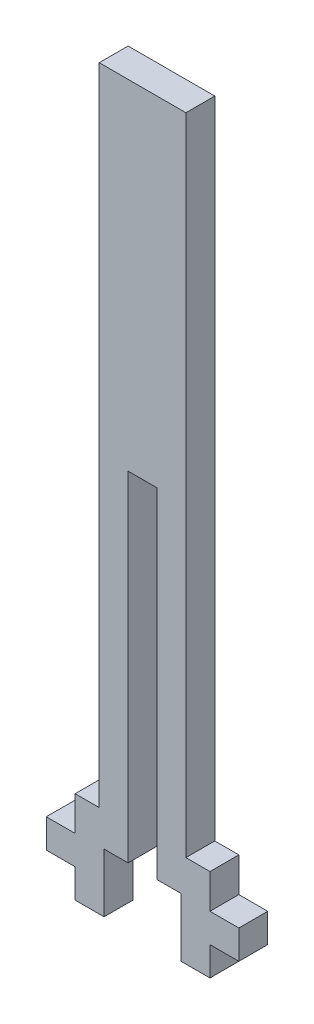
ISO-10303-21;
HEADER;
FILE_DESCRIPTION(('STEP AP214'),'2;1');
FILE_NAME('part.step','',(''),(''),'','','');
FILE_SCHEMA(('AUTOMOTIVE_DESIGN { 1 0 10303 214 1 1 1 1 }'));
ENDSEC;
DATA;
#1=APPLICATION_CONTEXT('core data for automotive mechanical design processes');
#2=APPLICATION_PROTOCOL_DEFINITION('international standard','automotive_design',2000,#1);
#3=PRODUCT_CONTEXT('',#1,'mechanical');
#4=PRODUCT('Part','Part','',(#3));
#5=PRODUCT_RELATED_PRODUCT_CATEGORY('part','',(#4));
#6=PRODUCT_DEFINITION_FORMATION('','',#4);
#7=PRODUCT_DEFINITION_CONTEXT('part definition',#1,'design');
#8=PRODUCT_DEFINITION('design','',#6,#7);
#9=PRODUCT_DEFINITION_SHAPE('','',#8);
#10=(LENGTH_UNIT() NAMED_UNIT(*) SI_UNIT(.MILLI.,.METRE.));
#11=(NAMED_UNIT(*) PLANE_ANGLE_UNIT() SI_UNIT($,.RADIAN.));
#12=(NAMED_UNIT(*) SI_UNIT($,.STERADIAN.) SOLID_ANGLE_UNIT());
#13=UNCERTAINTY_MEASURE_WITH_UNIT(LENGTH_MEASURE(1.E-05),#10,'distance_accuracy_value','');
#14=(GEOMETRIC_REPRESENTATION_CONTEXT(3) GLOBAL_UNCERTAINTY_ASSIGNED_CONTEXT((#13)) GLOBAL_UNIT_ASSIGNED_CONTEXT((#10,
#11,#12)) REPRESENTATION_CONTEXT('',''));
#15=CARTESIAN_POINT('',(0.,0.,0.));
#16=DIRECTION('',(0.,0.,1.));
#17=DIRECTION('',(1.,0.,0.));
#18=AXIS2_PLACEMENT_3D('',#15,#16,#17);
#19=CARTESIAN_POINT('',(7.,0.,3.));
#20=DIRECTION('',(-1.,0.,0.));
#21=DIRECTION('',(0.,0.,1.));
#22=AXIS2_PLACEMENT_3D('',#19,#20,#21);
#23=PLANE('',#22);
#24=DIRECTION('',(0.,0.,1.));
#25=VECTOR('',#24,1.);
#26=CARTESIAN_POINT('',(7.,-32.281500037,0.));
#27=LINE('',#26,#25);
#28=CARTESIAN_POINT('',(7.,-32.281500037,0.));
#29=VERTEX_POINT('',#28);
#30=CARTESIAN_POINT('',(7.,-32.281500037,3.));
#31=VERTEX_POINT('',#30);
#32=EDGE_CURVE('E211',#29,#31,#27,.T.);
#33=ORIENTED_EDGE('',*,*,#32,.F.);
#34=DIRECTION('',(0.,1.,0.));
#35=VECTOR('',#34,1.);
#36=CARTESIAN_POINT('',(7.,0.,0.));
#37=LINE('',#36,#35);
#38=CARTESIAN_POINT('',(7.,-28.706499941,0.));
#39=VERTEX_POINT('',#38);
#40=EDGE_CURVE('E306',#29,#39,#37,.T.);
#41=ORIENTED_EDGE('',*,*,#40,.T.);
#42=DIRECTION('',(0.,0.,-1.));
#43=VECTOR('',#42,1.);
#44=CARTESIAN_POINT('',(7.,-28.706499941,3.));
#45=LINE('',#44,#43);
#46=CARTESIAN_POINT('',(7.,-28.706499941,3.));
#47=VERTEX_POINT('',#46);
#48=EDGE_CURVE('E235',#47,#39,#45,.T.);
#49=ORIENTED_EDGE('',*,*,#48,.F.);
#50=DIRECTION('',(0.,1.,0.));
#51=VECTOR('',#50,1.);
#52=CARTESIAN_POINT('',(7.,0.,3.));
#53=LINE('',#52,#51);
#54=EDGE_CURVE('E227',#31,#47,#53,.T.);
#55=ORIENTED_EDGE('',*,*,#54,.F.);
#56=EDGE_LOOP('',(#33,#41,#49,#55));
#57=FACE_BOUND('',#56,.T.);
#58=ADVANCED_FACE('F50',(#57),#23,.F.);
#59=CARTESIAN_POINT('',(-7.,0.,3.));
#60=DIRECTION('',(1.,0.,0.));
#61=DIRECTION('',(0.,0.,-1.));
#62=AXIS2_PLACEMENT_3D('',#59,#60,#61);
#63=PLANE('',#62);
#64=DIRECTION('',(0.,0.,1.));
#65=VECTOR('',#64,1.);
#66=CARTESIAN_POINT('',(-7.,-35.281500037,0.));
#67=LINE('',#66,#65);
#68=CARTESIAN_POINT('',(-7.,-35.281500037,0.));
#69=VERTEX_POINT('',#68);
#70=CARTESIAN_POINT('',(-7.,-35.281500037,3.));
#71=VERTEX_POINT('',#70);
#72=EDGE_CURVE('E420',#69,#71,#67,.T.);
#73=ORIENTED_EDGE('',*,*,#72,.F.);
#74=DIRECTION('',(0.,-1.,0.));
#75=VECTOR('',#74,1.);
#76=CARTESIAN_POINT('',(-7.,0.,0.));
#77=LINE('',#76,#75);
#78=CARTESIAN_POINT('',(-7.,-38.281500037,0.));
#79=VERTEX_POINT('',#78);
#80=EDGE_CURVE('E283',#69,#79,#77,.T.);
#81=ORIENTED_EDGE('',*,*,#80,.T.);
#82=DIRECTION('',(0.,0.,-1.));
#83=VECTOR('',#82,1.);
#84=CARTESIAN_POINT('',(-7.,-38.281500037,3.));
#85=LINE('',#84,#83);
#86=CARTESIAN_POINT('',(-7.,-38.281500037,3.));
#87=VERTEX_POINT('',#86);
#88=EDGE_CURVE('E346',#87,#79,#85,.T.);
#89=ORIENTED_EDGE('',*,*,#88,.F.);
#90=DIRECTION('',(0.,-1.,0.));
#91=VECTOR('',#90,1.);
#92=CARTESIAN_POINT('',(-7.,0.,3.));
#93=LINE('',#92,#91);
#94=EDGE_CURVE('E877',#71,#87,#93,.T.);
#95=ORIENTED_EDGE('',*,*,#94,.F.);
#96=EDGE_LOOP('',(#73,#81,#89,#95));
#97=FACE_BOUND('',#96,.T.);
#98=ADVANCED_FACE('F544',(#97),#63,.F.);
#99=CARTESIAN_POINT('',(0.,-32.181500037,3.));
#100=DIRECTION('',(0.,1.,0.));
#101=DIRECTION('',(0.,0.,1.));
#102=AXIS2_PLACEMENT_3D('',#99,#100,#101);
#103=PLANE('',#102);
#104=DIRECTION('',(1.,0.,0.));
#105=VECTOR('',#104,1.);
#106=CARTESIAN_POINT('',(0.,-32.181500037,3.));
#107=LINE('',#106,#105);
#108=CARTESIAN_POINT('',(1.5,-32.181500037,3.));
#109=VERTEX_POINT('',#108);
#110=CARTESIAN_POINT('',(4.,-32.181500037,3.));
#111=VERTEX_POINT('',#110);
#112=EDGE_CURVE('E500',#109,#111,#107,.T.);
#113=ORIENTED_EDGE('',*,*,#112,.F.);
#114=DIRECTION('',(0.,0.,-1.));
#115=VECTOR('',#114,1.);
#116=CARTESIAN_POINT('',(1.5,-32.181500037,38.3589959537475));
#117=LINE('',#116,#115);
#118=CARTESIAN_POINT('',(1.5,-32.181500037,0.));
#119=VERTEX_POINT('',#118);
#120=EDGE_CURVE('E396',#109,#119,#117,.T.);
#121=ORIENTED_EDGE('',*,*,#120,.T.);
#122=DIRECTION('',(1.,0.,0.));
#123=VECTOR('',#122,1.);
#124=CARTESIAN_POINT('',(0.,-32.181500037,0.));
#125=LINE('',#124,#123);
#126=CARTESIAN_POINT('',(4.,-32.181500037,0.));
#127=VERTEX_POINT('',#126);
#128=EDGE_CURVE('E294',#119,#127,#125,.T.);
#129=ORIENTED_EDGE('',*,*,#128,.T.);
#130=DIRECTION('',(0.,0.,-1.));
#131=VECTOR('',#130,1.);
#132=CARTESIAN_POINT('',(4.,-32.181500037,3.));
#133=LINE('',#132,#131);
#134=EDGE_CURVE('E334',#111,#127,#133,.T.);
#135=ORIENTED_EDGE('',*,*,#134,.F.);
#136=EDGE_LOOP('',(#113,#121,#129,#135));
#137=FACE_BOUND('',#136,.T.);
#138=ADVANCED_FACE('F521',(#137),#103,.F.);
#139=CARTESIAN_POINT('',(0.,38.281500037,3.));
#140=DIRECTION('',(0.,1.,0.));
#141=DIRECTION('',(0.,0.,1.));
#142=AXIS2_PLACEMENT_3D('',#139,#140,#141);
#143=PLANE('',#142);
#144=DIRECTION('',(1.,0.,0.));
#145=VECTOR('',#144,1.);
#146=CARTESIAN_POINT('',(0.,38.281500037,0.));
#147=LINE('',#146,#145);
#148=CARTESIAN_POINT('',(-4.5,38.281500037,0.));
#149=VERTEX_POINT('',#148);
#150=CARTESIAN_POINT('',(4.5,38.281500037,0.));
#151=VERTEX_POINT('',#150);
#152=EDGE_CURVE('E271',#149,#151,#147,.T.);
#153=ORIENTED_EDGE('',*,*,#152,.F.);
#154=DIRECTION('',(0.,0.,-1.));
#155=VECTOR('',#154,1.);
#156=CARTESIAN_POINT('',(-4.5,38.281500037,3.));
#157=LINE('',#156,#155);
#158=CARTESIAN_POINT('',(-4.5,38.281500037,3.));
#159=VERTEX_POINT('',#158);
#160=EDGE_CURVE('E12',#159,#149,#157,.T.);
#161=ORIENTED_EDGE('',*,*,#160,.F.);
#162=DIRECTION('',(1.,0.,0.));
#163=VECTOR('',#162,1.);
#164=CARTESIAN_POINT('',(0.,38.281500037,3.));
#165=LINE('',#164,#163);
#166=CARTESIAN_POINT('',(4.5,38.281500037,3.));
#167=VERTEX_POINT('',#166);
#168=EDGE_CURVE('E319',#159,#167,#165,.T.);
#169=ORIENTED_EDGE('',*,*,#168,.T.);
#170=DIRECTION('',(0.,0.,-1.));
#171=VECTOR('',#170,1.);
#172=CARTESIAN_POINT('',(4.5,38.281500037,3.));
#173=LINE('',#172,#171);
#174=EDGE_CURVE('E270',#167,#151,#173,.T.);
#175=ORIENTED_EDGE('',*,*,#174,.T.);
#176=EDGE_LOOP('',(#153,#161,#169,#175));
#177=FACE_BOUND('',#176,.T.);
#178=ADVANCED_FACE('F52',(#177),#143,.T.);
#179=CARTESIAN_POINT('',(-4.5,0.,3.));
#180=DIRECTION('',(-1.,0.,0.));
#181=DIRECTION('',(0.,0.,1.));
#182=AXIS2_PLACEMENT_3D('',#179,#180,#181);
#183=PLANE('',#182);
#184=DIRECTION('',(0.,1.,0.));
#185=VECTOR('',#184,1.);
#186=CARTESIAN_POINT('',(-4.5,0.,0.));
#187=LINE('',#186,#185);
#188=CARTESIAN_POINT('',(-4.5,-28.706499941,0.));
#189=VERTEX_POINT('',#188);
#190=EDGE_CURVE('E275',#189,#149,#187,.T.);
#191=ORIENTED_EDGE('',*,*,#190,.F.);
#192=DIRECTION('',(0.,0.,-1.));
#193=VECTOR('',#192,1.);
#194=CARTESIAN_POINT('',(-4.5,-28.706499941,3.));
#195=LINE('',#194,#193);
#196=CARTESIAN_POINT('',(-4.5,-28.706499941,3.));
#197=VERTEX_POINT('',#196);
#198=EDGE_CURVE('E59',#197,#189,#195,.T.);
#199=ORIENTED_EDGE('',*,*,#198,.F.);
#200=DIRECTION('',(0.,1.,0.));
#201=VECTOR('',#200,1.);
#202=CARTESIAN_POINT('',(-4.5,0.,3.));
#203=LINE('',#202,#201);
#204=EDGE_CURVE('E371',#197,#159,#203,.T.);
#205=ORIENTED_EDGE('',*,*,#204,.T.);
#206=ORIENTED_EDGE('',*,*,#160,.T.);
#207=EDGE_LOOP('',(#191,#199,#205,#206));
#208=FACE_BOUND('',#207,.T.);
#209=ADVANCED_FACE('F369',(#208),#183,.T.);
#210=CARTESIAN_POINT('',(0.,-28.706499941,3.));
#211=DIRECTION('',(0.,-1.,0.));
#212=DIRECTION('',(0.,0.,-1.));
#213=AXIS2_PLACEMENT_3D('',#210,#211,#212);
#214=PLANE('',#213);
#215=DIRECTION('',(-1.,0.,0.));
#216=VECTOR('',#215,1.);
#217=CARTESIAN_POINT('',(0.,-28.706499941,0.));
#218=LINE('',#217,#216);
#219=CARTESIAN_POINT('',(-7.,-28.706499941,0.));
#220=VERTEX_POINT('',#219);
#221=EDGE_CURVE('E280',#189,#220,#218,.T.);
#222=ORIENTED_EDGE('',*,*,#221,.T.);
#223=DIRECTION('',(0.,0.,-1.));
#224=VECTOR('',#223,1.);
#225=CARTESIAN_POINT('',(-7.,-28.706499941,3.));
#226=LINE('',#225,#224);
#227=CARTESIAN_POINT('',(-7.,-28.706499941,3.));
#228=VERTEX_POINT('',#227);
#229=EDGE_CURVE('E350',#228,#220,#226,.T.);
#230=ORIENTED_EDGE('',*,*,#229,.F.);
#231=DIRECTION('',(-1.,0.,0.));
#232=VECTOR('',#231,1.);
#233=CARTESIAN_POINT('',(0.,-28.706499941,3.));
#234=LINE('',#233,#232);
#235=EDGE_CURVE('E359',#197,#228,#234,.T.);
#236=ORIENTED_EDGE('',*,*,#235,.F.);
#237=ORIENTED_EDGE('',*,*,#198,.T.);
#238=EDGE_LOOP('',(#222,#230,#236,#237));
#239=FACE_BOUND('',#238,.T.);
#240=ADVANCED_FACE('F357',(#239),#214,.F.);
#241=CARTESIAN_POINT('',(-7.,-32.281500037,0.));
#242=VERTEX_POINT('',#241);
#243=EDGE_CURVE('E284',#220,#242,#77,.T.);
#244=ORIENTED_EDGE('',*,*,#243,.T.);
#245=DIRECTION('',(0.,0.,1.));
#246=VECTOR('',#245,1.);
#247=CARTESIAN_POINT('',(-7.,-32.281500037,0.));
#248=LINE('',#247,#246);
#249=CARTESIAN_POINT('',(-7.,-32.281500037,3.));
#250=VERTEX_POINT('',#249);
#251=EDGE_CURVE('E429',#242,#250,#248,.T.);
#252=ORIENTED_EDGE('',*,*,#251,.T.);
#253=EDGE_CURVE('E874',#228,#250,#93,.T.);
#254=ORIENTED_EDGE('',*,*,#253,.F.);
#255=ORIENTED_EDGE('',*,*,#229,.T.);
#256=EDGE_LOOP('',(#244,#252,#254,#255));
#257=FACE_BOUND('',#256,.T.);
#258=ADVANCED_FACE('F551',(#257),#63,.F.);
#259=CARTESIAN_POINT('',(0.,-38.281500037,3.));
#260=DIRECTION('',(0.,1.,0.));
#261=DIRECTION('',(0.,0.,1.));
#262=AXIS2_PLACEMENT_3D('',#259,#260,#261);
#263=PLANE('',#262);
#264=DIRECTION('',(1.,0.,0.));
#265=VECTOR('',#264,1.);
#266=CARTESIAN_POINT('',(0.,-38.281500037,0.));
#267=LINE('',#266,#265);
#268=CARTESIAN_POINT('',(-4.,-38.281500037,0.));
#269=VERTEX_POINT('',#268);
#270=EDGE_CURVE('E288',#79,#269,#267,.T.);
#271=ORIENTED_EDGE('',*,*,#270,.T.);
#272=DIRECTION('',(0.,0.,-1.));
#273=VECTOR('',#272,1.);
#274=CARTESIAN_POINT('',(-4.,-38.281500037,3.));
#275=LINE('',#274,#273);
#276=CARTESIAN_POINT('',(-4.,-38.281500037,3.));
#277=VERTEX_POINT('',#276);
#278=EDGE_CURVE('E342',#277,#269,#275,.T.);
#279=ORIENTED_EDGE('',*,*,#278,.F.);
#280=DIRECTION('',(1.,0.,0.));
#281=VECTOR('',#280,1.);
#282=CARTESIAN_POINT('',(0.,-38.281500037,3.));
#283=LINE('',#282,#281);
#284=EDGE_CURVE('E876',#87,#277,#283,.T.);
#285=ORIENTED_EDGE('',*,*,#284,.F.);
#286=ORIENTED_EDGE('',*,*,#88,.T.);
#287=EDGE_LOOP('',(#271,#279,#285,#286));
#288=FACE_BOUND('',#287,.T.);
#289=ADVANCED_FACE('F571',(#288),#263,.F.);
#290=CARTESIAN_POINT('',(-4.,0.,3.));
#291=DIRECTION('',(-1.,0.,0.));
#292=DIRECTION('',(0.,0.,1.));
#293=AXIS2_PLACEMENT_3D('',#290,#291,#292);
#294=PLANE('',#293);
#295=DIRECTION('',(0.,1.,0.));
#296=VECTOR('',#295,1.);
#297=CARTESIAN_POINT('',(-4.,0.,0.));
#298=LINE('',#297,#296);
#299=CARTESIAN_POINT('',(-4.,-32.181500037,0.));
#300=VERTEX_POINT('',#299);
#301=EDGE_CURVE('E291',#269,#300,#298,.T.);
#302=ORIENTED_EDGE('',*,*,#301,.T.);
#303=DIRECTION('',(0.,0.,-1.));
#304=VECTOR('',#303,1.);
#305=CARTESIAN_POINT('',(-4.,-32.181500037,3.));
#306=LINE('',#305,#304);
#307=CARTESIAN_POINT('',(-4.,-32.181500037,3.));
#308=VERTEX_POINT('',#307);
#309=EDGE_CURVE('E338',#308,#300,#306,.T.);
#310=ORIENTED_EDGE('',*,*,#309,.F.);
#311=DIRECTION('',(0.,1.,0.));
#312=VECTOR('',#311,1.);
#313=CARTESIAN_POINT('',(-4.,0.,3.));
#314=LINE('',#313,#312);
#315=EDGE_CURVE('E501',#277,#308,#314,.T.);
#316=ORIENTED_EDGE('',*,*,#315,.F.);
#317=ORIENTED_EDGE('',*,*,#278,.T.);
#318=EDGE_LOOP('',(#302,#310,#316,#317));
#319=FACE_BOUND('',#318,.T.);
#320=ADVANCED_FACE('F567',(#319),#294,.F.);
#321=CARTESIAN_POINT('',(-1.5,-32.181500037,0.));
#322=VERTEX_POINT('',#321);
#323=EDGE_CURVE('E295',#300,#322,#125,.T.);
#324=ORIENTED_EDGE('',*,*,#323,.T.);
#325=DIRECTION('',(0.,0.,-1.));
#326=VECTOR('',#325,1.);
#327=CARTESIAN_POINT('',(-1.5,-32.181500037,38.3589959537475));
#328=LINE('',#327,#326);
#329=CARTESIAN_POINT('',(-1.5,-32.181500037,3.));
#330=VERTEX_POINT('',#329);
#331=EDGE_CURVE('E393',#330,#322,#328,.T.);
#332=ORIENTED_EDGE('',*,*,#331,.F.);
#333=EDGE_CURVE('E496',#308,#330,#107,.T.);
#334=ORIENTED_EDGE('',*,*,#333,.F.);
#335=ORIENTED_EDGE('',*,*,#309,.T.);
#336=EDGE_LOOP('',(#324,#332,#334,#335));
#337=FACE_BOUND('',#336,.T.);
#338=ADVANCED_FACE('F562',(#337),#103,.F.);
#339=CARTESIAN_POINT('',(4.,0.,3.));
#340=DIRECTION('',(-1.,0.,0.));
#341=DIRECTION('',(0.,0.,1.));
#342=AXIS2_PLACEMENT_3D('',#339,#340,#341);
#343=PLANE('',#342);
#344=DIRECTION('',(0.,1.,0.));
#345=VECTOR('',#344,1.);
#346=CARTESIAN_POINT('',(4.,0.,0.));
#347=LINE('',#346,#345);
#348=CARTESIAN_POINT('',(4.,-38.281500037,0.));
#349=VERTEX_POINT('',#348);
#350=EDGE_CURVE('E299',#349,#127,#347,.T.);
#351=ORIENTED_EDGE('',*,*,#350,.F.);
#352=DIRECTION('',(0.,0.,-1.));
#353=VECTOR('',#352,1.);
#354=CARTESIAN_POINT('',(4.,-38.281500037,3.));
#355=LINE('',#354,#353);
#356=CARTESIAN_POINT('',(4.,-38.281500037,3.));
#357=VERTEX_POINT('',#356);
#358=EDGE_CURVE('E331',#357,#349,#355,.T.);
#359=ORIENTED_EDGE('',*,*,#358,.F.);
#360=DIRECTION('',(0.,1.,0.));
#361=VECTOR('',#360,1.);
#362=CARTESIAN_POINT('',(4.,0.,3.));
#363=LINE('',#362,#361);
#364=EDGE_CURVE('E245',#357,#111,#363,.T.);
#365=ORIENTED_EDGE('',*,*,#364,.T.);
#366=ORIENTED_EDGE('',*,*,#134,.T.);
#367=EDGE_LOOP('',(#351,#359,#365,#366));
#368=FACE_BOUND('',#367,.T.);
#369=ADVANCED_FACE('F514',(#368),#343,.T.);
#370=CARTESIAN_POINT('',(0.,-38.281500037,3.));
#371=DIRECTION('',(0.,1.,0.));
#372=DIRECTION('',(0.,0.,1.));
#373=AXIS2_PLACEMENT_3D('',#370,#371,#372);
#374=PLANE('',#373);
#375=DIRECTION('',(1.,0.,0.));
#376=VECTOR('',#375,1.);
#377=CARTESIAN_POINT('',(0.,-38.281500037,0.));
#378=LINE('',#377,#376);
#379=CARTESIAN_POINT('',(7.,-38.281500037,0.));
#380=VERTEX_POINT('',#379);
#381=EDGE_CURVE('E303',#349,#380,#378,.T.);
#382=ORIENTED_EDGE('',*,*,#381,.T.);
#383=DIRECTION('',(0.,0.,-1.));
#384=VECTOR('',#383,1.);
#385=CARTESIAN_POINT('',(7.,-38.281500037,3.));
#386=LINE('',#385,#384);
#387=CARTESIAN_POINT('',(7.,-38.281500037,3.));
#388=VERTEX_POINT('',#387);
#389=EDGE_CURVE('E327',#388,#380,#386,.T.);
#390=ORIENTED_EDGE('',*,*,#389,.F.);
#391=DIRECTION('',(1.,0.,0.));
#392=VECTOR('',#391,1.);
#393=CARTESIAN_POINT('',(0.,-38.281500037,3.));
#394=LINE('',#393,#392);
#395=EDGE_CURVE('E239',#357,#388,#394,.T.);
#396=ORIENTED_EDGE('',*,*,#395,.F.);
#397=ORIENTED_EDGE('',*,*,#358,.T.);
#398=EDGE_LOOP('',(#382,#390,#396,#397));
#399=FACE_BOUND('',#398,.T.);
#400=ADVANCED_FACE('F528',(#399),#374,.F.);
#401=CARTESIAN_POINT('',(7.,-35.281500037,0.));
#402=VERTEX_POINT('',#401);
#403=EDGE_CURVE('E307',#380,#402,#37,.T.);
#404=ORIENTED_EDGE('',*,*,#403,.T.);
#405=DIRECTION('',(0.,0.,1.));
#406=VECTOR('',#405,1.);
#407=CARTESIAN_POINT('',(7.,-35.281500037,0.));
#408=LINE('',#407,#406);
#409=CARTESIAN_POINT('',(7.,-35.281500037,3.));
#410=VERTEX_POINT('',#409);
#411=EDGE_CURVE('E466',#402,#410,#408,.T.);
#412=ORIENTED_EDGE('',*,*,#411,.T.);
#413=EDGE_CURVE('E238',#388,#410,#53,.T.);
#414=ORIENTED_EDGE('',*,*,#413,.F.);
#415=ORIENTED_EDGE('',*,*,#389,.T.);
#416=EDGE_LOOP('',(#404,#412,#414,#415));
#417=FACE_BOUND('',#416,.T.);
#418=ADVANCED_FACE('F531',(#417),#23,.F.);
#419=CARTESIAN_POINT('',(0.,-28.706499941,3.));
#420=DIRECTION('',(0.,-1.,0.));
#421=DIRECTION('',(0.,0.,-1.));
#422=AXIS2_PLACEMENT_3D('',#419,#420,#421);
#423=PLANE('',#422);
#424=DIRECTION('',(-1.,0.,0.));
#425=VECTOR('',#424,1.);
#426=CARTESIAN_POINT('',(0.,-28.706499941,0.));
#427=LINE('',#426,#425);
#428=CARTESIAN_POINT('',(4.5,-28.706499941,0.));
#429=VERTEX_POINT('',#428);
#430=EDGE_CURVE('E311',#39,#429,#427,.T.);
#431=ORIENTED_EDGE('',*,*,#430,.T.);
#432=DIRECTION('',(0.,0.,-1.));
#433=VECTOR('',#432,1.);
#434=CARTESIAN_POINT('',(4.5,-28.706499941,3.));
#435=LINE('',#434,#433);
#436=CARTESIAN_POINT('',(4.5,-28.706499941,3.));
#437=VERTEX_POINT('',#436);
#438=EDGE_CURVE('E322',#437,#429,#435,.T.);
#439=ORIENTED_EDGE('',*,*,#438,.F.);
#440=DIRECTION('',(-1.,0.,0.));
#441=VECTOR('',#440,1.);
#442=CARTESIAN_POINT('',(0.,-28.706499941,3.));
#443=LINE('',#442,#441);
#444=EDGE_CURVE('E244',#47,#437,#443,.T.);
#445=ORIENTED_EDGE('',*,*,#444,.F.);
#446=ORIENTED_EDGE('',*,*,#48,.T.);
#447=EDGE_LOOP('',(#431,#439,#445,#446));
#448=FACE_BOUND('',#447,.T.);
#449=ADVANCED_FACE('F382',(#448),#423,.F.);
#450=CARTESIAN_POINT('',(4.5,0.,3.));
#451=DIRECTION('',(1.,0.,0.));
#452=DIRECTION('',(0.,0.,-1.));
#453=AXIS2_PLACEMENT_3D('',#450,#451,#452);
#454=PLANE('',#453);
#455=DIRECTION('',(0.,-1.,0.));
#456=VECTOR('',#455,1.);
#457=CARTESIAN_POINT('',(4.5,0.,0.));
#458=LINE('',#457,#456);
#459=EDGE_CURVE('E315',#151,#429,#458,.T.);
#460=ORIENTED_EDGE('',*,*,#459,.F.);
#461=ORIENTED_EDGE('',*,*,#174,.F.);
#462=DIRECTION('',(0.,-1.,0.));
#463=VECTOR('',#462,1.);
#464=CARTESIAN_POINT('',(4.5,0.,3.));
#465=LINE('',#464,#463);
#466=EDGE_CURVE('E265',#167,#437,#465,.T.);
#467=ORIENTED_EDGE('',*,*,#466,.T.);
#468=ORIENTED_EDGE('',*,*,#438,.T.);
#469=EDGE_LOOP('',(#460,#461,#467,#468));
#470=FACE_BOUND('',#469,.T.);
#471=ADVANCED_FACE('F378',(#470),#454,.T.);
#472=CARTESIAN_POINT('',(0.,0.,3.));
#473=DIRECTION('',(0.,0.,1.));
#474=DIRECTION('',(1.,0.,0.));
#475=AXIS2_PLACEMENT_3D('',#472,#473,#474);
#476=PLANE('',#475);
#477=DIRECTION('',(0.,-1.,0.));
#478=VECTOR('',#477,1.);
#479=CARTESIAN_POINT('',(1.5,-32.181500037,3.));
#480=LINE('',#479,#478);
#481=CARTESIAN_POINT('',(1.49999999999999,3.05,3.));
#482=VERTEX_POINT('',#481);
#483=EDGE_CURVE('E400',#482,#109,#480,.T.);
#484=ORIENTED_EDGE('',*,*,#483,.T.);
#485=ORIENTED_EDGE('',*,*,#112,.T.);
#486=ORIENTED_EDGE('',*,*,#364,.F.);
#487=ORIENTED_EDGE('',*,*,#395,.T.);
#488=ORIENTED_EDGE('',*,*,#413,.T.);
#489=DIRECTION('',(1.,0.,0.));
#490=VECTOR('',#489,1.);
#491=CARTESIAN_POINT('',(7.,-35.281500037,3.));
#492=LINE('',#491,#490);
#493=CARTESIAN_POINT('',(10.,-35.281500037,3.));
#494=VERTEX_POINT('',#493);
#495=EDGE_CURVE('E66',#410,#494,#492,.T.);
#496=ORIENTED_EDGE('',*,*,#495,.T.);
#497=DIRECTION('',(0.,1.,0.));
#498=VECTOR('',#497,1.);
#499=CARTESIAN_POINT('',(10.,-32.281500037,3.));
#500=LINE('',#499,#498);
#501=CARTESIAN_POINT('',(10.,-32.281500037,3.));
#502=VERTEX_POINT('',#501);
#503=EDGE_CURVE('E230',#494,#502,#500,.T.);
#504=ORIENTED_EDGE('',*,*,#503,.T.);
#505=DIRECTION('',(-1.,0.,0.));
#506=VECTOR('',#505,1.);
#507=CARTESIAN_POINT('',(7.,-32.281500037,3.));
#508=LINE('',#507,#506);
#509=EDGE_CURVE('E214',#502,#31,#508,.T.);
#510=ORIENTED_EDGE('',*,*,#509,.T.);
#511=ORIENTED_EDGE('',*,*,#54,.T.);
#512=ORIENTED_EDGE('',*,*,#444,.T.);
#513=ORIENTED_EDGE('',*,*,#466,.F.);
#514=ORIENTED_EDGE('',*,*,#168,.F.);
#515=ORIENTED_EDGE('',*,*,#204,.F.);
#516=ORIENTED_EDGE('',*,*,#235,.T.);
#517=ORIENTED_EDGE('',*,*,#253,.T.);
#518=DIRECTION('',(-1.,0.,0.));
#519=VECTOR('',#518,1.);
#520=CARTESIAN_POINT('',(-7.,-32.281500037,3.));
#521=LINE('',#520,#519);
#522=CARTESIAN_POINT('',(-10.,-32.281500037,3.));
#523=VERTEX_POINT('',#522);
#524=EDGE_CURVE('E74',#250,#523,#521,.T.);
#525=ORIENTED_EDGE('',*,*,#524,.T.);
#526=DIRECTION('',(0.,-1.,0.));
#527=VECTOR('',#526,1.);
#528=CARTESIAN_POINT('',(-10.,-32.281500037,3.));
#529=LINE('',#528,#527);
#530=CARTESIAN_POINT('',(-10.,-35.281500037,3.));
#531=VERTEX_POINT('',#530);
#532=EDGE_CURVE('E447',#523,#531,#529,.T.);
#533=ORIENTED_EDGE('',*,*,#532,.T.);
#534=DIRECTION('',(1.,0.,0.));
#535=VECTOR('',#534,1.);
#536=CARTESIAN_POINT('',(-7.,-35.281500037,3.));
#537=LINE('',#536,#535);
#538=EDGE_CURVE('E443',#531,#71,#537,.T.);
#539=ORIENTED_EDGE('',*,*,#538,.T.);
#540=ORIENTED_EDGE('',*,*,#94,.T.);
#541=ORIENTED_EDGE('',*,*,#284,.T.);
#542=ORIENTED_EDGE('',*,*,#315,.T.);
#543=ORIENTED_EDGE('',*,*,#333,.T.);
#544=DIRECTION('',(0.,1.,0.));
#545=VECTOR('',#544,1.);
#546=CARTESIAN_POINT('',(-1.5,-32.181500037,3.));
#547=LINE('',#546,#545);
#548=CARTESIAN_POINT('',(-1.50000000000001,3.05,3.));
#549=VERTEX_POINT('',#548);
#550=EDGE_CURVE('E389',#330,#549,#547,.T.);
#551=ORIENTED_EDGE('',*,*,#550,.T.);
#552=DIRECTION('',(1.,0.,0.));
#553=VECTOR('',#552,1.);
#554=CARTESIAN_POINT('',(1.49999999999999,3.05,3.));
#555=LINE('',#554,#553);
#556=EDGE_CURVE('E406',#549,#482,#555,.T.);
#557=ORIENTED_EDGE('',*,*,#556,.T.);
#558=EDGE_LOOP('',(#484,#485,#486,#487,#488,#496,#504,#510,#511,#512,#513,#514,#515,#516,#517,
#525,#533,#539,#540,#541,#542,#543,#551,#557));
#559=FACE_BOUND('',#558,.T.);
#560=ADVANCED_FACE('F226',(#559),#476,.T.);
#561=CARTESIAN_POINT('',(0.,0.,0.));
#562=DIRECTION('',(0.,0.,1.));
#563=DIRECTION('',(1.,0.,0.));
#564=AXIS2_PLACEMENT_3D('',#561,#562,#563);
#565=PLANE('',#564);
#566=ORIENTED_EDGE('',*,*,#128,.F.);
#567=DIRECTION('',(0.,-1.,0.));
#568=VECTOR('',#567,1.);
#569=CARTESIAN_POINT('',(1.5,-32.181500037,0.));
#570=LINE('',#569,#568);
#571=CARTESIAN_POINT('',(1.49999999999999,3.05,0.));
#572=VERTEX_POINT('',#571);
#573=EDGE_CURVE('E410',#572,#119,#570,.T.);
#574=ORIENTED_EDGE('',*,*,#573,.F.);
#575=DIRECTION('',(1.,0.,0.));
#576=VECTOR('',#575,1.);
#577=CARTESIAN_POINT('',(1.49999999999999,3.05,0.));
#578=LINE('',#577,#576);
#579=CARTESIAN_POINT('',(-1.50000000000001,3.05,0.));
#580=VERTEX_POINT('',#579);
#581=EDGE_CURVE('E412',#580,#572,#578,.T.);
#582=ORIENTED_EDGE('',*,*,#581,.F.);
#583=DIRECTION('',(0.,1.,0.));
#584=VECTOR('',#583,1.);
#585=CARTESIAN_POINT('',(-1.5,-32.181500037,0.));
#586=LINE('',#585,#584);
#587=EDGE_CURVE('E416',#322,#580,#586,.T.);
#588=ORIENTED_EDGE('',*,*,#587,.F.);
#589=ORIENTED_EDGE('',*,*,#323,.F.);
#590=ORIENTED_EDGE('',*,*,#301,.F.);
#591=ORIENTED_EDGE('',*,*,#270,.F.);
#592=ORIENTED_EDGE('',*,*,#80,.F.);
#593=DIRECTION('',(1.,0.,0.));
#594=VECTOR('',#593,1.);
#595=CARTESIAN_POINT('',(-7.,-35.281500037,0.));
#596=LINE('',#595,#594);
#597=CARTESIAN_POINT('',(-10.,-35.281500037,0.));
#598=VERTEX_POINT('',#597);
#599=EDGE_CURVE('E432',#598,#69,#596,.T.);
#600=ORIENTED_EDGE('',*,*,#599,.F.);
#601=DIRECTION('',(0.,-1.,0.));
#602=VECTOR('',#601,1.);
#603=CARTESIAN_POINT('',(-10.,-32.281500037,0.));
#604=LINE('',#603,#602);
#605=CARTESIAN_POINT('',(-10.,-32.281500037,0.));
#606=VERTEX_POINT('',#605);
#607=EDGE_CURVE('E435',#606,#598,#604,.T.);
#608=ORIENTED_EDGE('',*,*,#607,.F.);
#609=DIRECTION('',(-1.,0.,0.));
#610=VECTOR('',#609,1.);
#611=CARTESIAN_POINT('',(-7.,-32.281500037,0.));
#612=LINE('',#611,#610);
#613=EDGE_CURVE('E439',#242,#606,#612,.T.);
#614=ORIENTED_EDGE('',*,*,#613,.F.);
#615=ORIENTED_EDGE('',*,*,#243,.F.);
#616=ORIENTED_EDGE('',*,*,#221,.F.);
#617=ORIENTED_EDGE('',*,*,#190,.T.);
#618=ORIENTED_EDGE('',*,*,#152,.T.);
#619=ORIENTED_EDGE('',*,*,#459,.T.);
#620=ORIENTED_EDGE('',*,*,#430,.F.);
#621=ORIENTED_EDGE('',*,*,#40,.F.);
#622=DIRECTION('',(-1.,0.,0.));
#623=VECTOR('',#622,1.);
#624=CARTESIAN_POINT('',(7.,-32.281500037,0.));
#625=LINE('',#624,#623);
#626=CARTESIAN_POINT('',(10.,-32.281500037,0.));
#627=VERTEX_POINT('',#626);
#628=EDGE_CURVE('E216',#627,#29,#625,.T.);
#629=ORIENTED_EDGE('',*,*,#628,.F.);
#630=DIRECTION('',(0.,1.,0.));
#631=VECTOR('',#630,1.);
#632=CARTESIAN_POINT('',(10.,-32.281500037,0.));
#633=LINE('',#632,#631);
#634=CARTESIAN_POINT('',(10.,-35.281500037,0.));
#635=VERTEX_POINT('',#634);
#636=EDGE_CURVE('E460',#635,#627,#633,.T.);
#637=ORIENTED_EDGE('',*,*,#636,.F.);
#638=DIRECTION('',(1.,0.,0.));
#639=VECTOR('',#638,1.);
#640=CARTESIAN_POINT('',(7.,-35.281500037,0.));
#641=LINE('',#640,#639);
#642=EDGE_CURVE('E232',#402,#635,#641,.T.);
#643=ORIENTED_EDGE('',*,*,#642,.F.);
#644=ORIENTED_EDGE('',*,*,#403,.F.);
#645=ORIENTED_EDGE('',*,*,#381,.F.);
#646=ORIENTED_EDGE('',*,*,#350,.T.);
#647=EDGE_LOOP('',(#566,#574,#582,#588,#589,#590,#591,#592,#600,#608,#614,#615,#616,#617,#618,
#619,#620,#621,#629,#637,#643,#644,#645,#646));
#648=FACE_BOUND('',#647,.T.);
#649=ADVANCED_FACE('F367',(#648),#565,.F.);
#650=CARTESIAN_POINT('',(1.49999999999999,3.05,38.3589959537475));
#651=DIRECTION('',(0.,1.,0.));
#652=DIRECTION('',(0.,0.,1.));
#653=AXIS2_PLACEMENT_3D('',#650,#651,#652);
#654=PLANE('',#653);
#655=DIRECTION('',(0.,0.,-1.));
#656=VECTOR('',#655,1.);
#657=CARTESIAN_POINT('',(-1.50000000000001,3.05,38.3589959537475));
#658=LINE('',#657,#656);
#659=EDGE_CURVE('E276',#549,#580,#658,.T.);
#660=ORIENTED_EDGE('',*,*,#659,.T.);
#661=ORIENTED_EDGE('',*,*,#581,.T.);
#662=DIRECTION('',(0.,0.,-1.));
#663=VECTOR('',#662,1.);
#664=CARTESIAN_POINT('',(1.49999999999999,3.05,38.3589959537475));
#665=LINE('',#664,#663);
#666=EDGE_CURVE('E403',#482,#572,#665,.T.);
#667=ORIENTED_EDGE('',*,*,#666,.F.);
#668=ORIENTED_EDGE('',*,*,#556,.F.);
#669=EDGE_LOOP('',(#660,#661,#667,#668));
#670=FACE_BOUND('',#669,.T.);
#671=ADVANCED_FACE('F627',(#670),#654,.F.);
#672=CARTESIAN_POINT('',(1.5,-32.181500037,38.3589959537475));
#673=DIRECTION('',(1.,0.,0.));
#674=DIRECTION('',(0.,1.,0.));
#675=AXIS2_PLACEMENT_3D('',#672,#673,#674);
#676=PLANE('',#675);
#677=ORIENTED_EDGE('',*,*,#666,.T.);
#678=ORIENTED_EDGE('',*,*,#573,.T.);
#679=ORIENTED_EDGE('',*,*,#120,.F.);
#680=ORIENTED_EDGE('',*,*,#483,.F.);
#681=EDGE_LOOP('',(#677,#678,#679,#680));
#682=FACE_BOUND('',#681,.T.);
#683=ADVANCED_FACE('F613',(#682),#676,.F.);
#684=CARTESIAN_POINT('',(-1.5,-32.181500037,38.3589959537475));
#685=DIRECTION('',(-1.,0.,0.));
#686=DIRECTION('',(0.,-1.,0.));
#687=AXIS2_PLACEMENT_3D('',#684,#685,#686);
#688=PLANE('',#687);
#689=ORIENTED_EDGE('',*,*,#331,.T.);
#690=ORIENTED_EDGE('',*,*,#587,.T.);
#691=ORIENTED_EDGE('',*,*,#659,.F.);
#692=ORIENTED_EDGE('',*,*,#550,.F.);
#693=EDGE_LOOP('',(#689,#690,#691,#692));
#694=FACE_BOUND('',#693,.T.);
#695=ADVANCED_FACE('F606',(#694),#688,.F.);
#696=CARTESIAN_POINT('',(-7.,-35.281500037,0.));
#697=DIRECTION('',(0.,-1.,0.));
#698=DIRECTION('',(0.,0.,-1.));
#699=AXIS2_PLACEMENT_3D('',#696,#697,#698);
#700=PLANE('',#699);
#701=ORIENTED_EDGE('',*,*,#538,.F.);
#702=DIRECTION('',(0.,0.,1.));
#703=VECTOR('',#702,1.);
#704=CARTESIAN_POINT('',(-10.,-35.281500037,0.));
#705=LINE('',#704,#703);
#706=EDGE_CURVE('E423',#598,#531,#705,.T.);
#707=ORIENTED_EDGE('',*,*,#706,.F.);
#708=ORIENTED_EDGE('',*,*,#599,.T.);
#709=ORIENTED_EDGE('',*,*,#72,.T.);
#710=EDGE_LOOP('',(#701,#707,#708,#709));
#711=FACE_BOUND('',#710,.T.);
#712=ADVANCED_FACE('F612',(#711),#700,.T.);
#713=CARTESIAN_POINT('',(-10.,-32.281500037,0.));
#714=DIRECTION('',(-1.,0.,0.));
#715=DIRECTION('',(0.,-1.,0.));
#716=AXIS2_PLACEMENT_3D('',#713,#714,#715);
#717=PLANE('',#716);
#718=ORIENTED_EDGE('',*,*,#532,.F.);
#719=DIRECTION('',(0.,0.,1.));
#720=VECTOR('',#719,1.);
#721=CARTESIAN_POINT('',(-10.,-32.281500037,0.));
#722=LINE('',#721,#720);
#723=EDGE_CURVE('E426',#606,#523,#722,.T.);
#724=ORIENTED_EDGE('',*,*,#723,.F.);
#725=ORIENTED_EDGE('',*,*,#607,.T.);
#726=ORIENTED_EDGE('',*,*,#706,.T.);
#727=EDGE_LOOP('',(#718,#724,#725,#726));
#728=FACE_BOUND('',#727,.T.);
#729=ADVANCED_FACE('F791',(#728),#717,.T.);
#730=CARTESIAN_POINT('',(-7.,-32.281500037,0.));
#731=DIRECTION('',(0.,1.,0.));
#732=DIRECTION('',(0.,0.,1.));
#733=AXIS2_PLACEMENT_3D('',#730,#731,#732);
#734=PLANE('',#733);
#735=ORIENTED_EDGE('',*,*,#524,.F.);
#736=ORIENTED_EDGE('',*,*,#251,.F.);
#737=ORIENTED_EDGE('',*,*,#613,.T.);
#738=ORIENTED_EDGE('',*,*,#723,.T.);
#739=EDGE_LOOP('',(#735,#736,#737,#738));
#740=FACE_BOUND('',#739,.T.);
#741=ADVANCED_FACE('F541',(#740),#734,.T.);
#742=CARTESIAN_POINT('',(7.,-32.281500037,0.));
#743=DIRECTION('',(0.,1.,0.));
#744=DIRECTION('',(0.,0.,1.));
#745=AXIS2_PLACEMENT_3D('',#742,#743,#744);
#746=PLANE('',#745);
#747=ORIENTED_EDGE('',*,*,#509,.F.);
#748=DIRECTION('',(0.,0.,1.));
#749=VECTOR('',#748,1.);
#750=CARTESIAN_POINT('',(10.,-32.281500037,0.));
#751=LINE('',#750,#749);
#752=EDGE_CURVE('E221',#627,#502,#751,.T.);
#753=ORIENTED_EDGE('',*,*,#752,.F.);
#754=ORIENTED_EDGE('',*,*,#628,.T.);
#755=ORIENTED_EDGE('',*,*,#32,.T.);
#756=EDGE_LOOP('',(#747,#753,#754,#755));
#757=FACE_BOUND('',#756,.T.);
#758=ADVANCED_FACE('F213',(#757),#746,.T.);
#759=CARTESIAN_POINT('',(10.,-32.281500037,0.));
#760=DIRECTION('',(1.,0.,0.));
#761=DIRECTION('',(0.,1.,0.));
#762=AXIS2_PLACEMENT_3D('',#759,#760,#761);
#763=PLANE('',#762);
#764=ORIENTED_EDGE('',*,*,#503,.F.);
#765=DIRECTION('',(0.,0.,1.));
#766=VECTOR('',#765,1.);
#767=CARTESIAN_POINT('',(10.,-35.281500037,0.));
#768=LINE('',#767,#766);
#769=EDGE_CURVE('E469',#635,#494,#768,.T.);
#770=ORIENTED_EDGE('',*,*,#769,.F.);
#771=ORIENTED_EDGE('',*,*,#636,.T.);
#772=ORIENTED_EDGE('',*,*,#752,.T.);
#773=EDGE_LOOP('',(#764,#770,#771,#772));
#774=FACE_BOUND('',#773,.T.);
#775=ADVANCED_FACE('F533',(#774),#763,.T.);
#776=CARTESIAN_POINT('',(7.,-35.281500037,0.));
#777=DIRECTION('',(0.,-1.,0.));
#778=DIRECTION('',(0.,0.,-1.));
#779=AXIS2_PLACEMENT_3D('',#776,#777,#778);
#780=PLANE('',#779);
#781=ORIENTED_EDGE('',*,*,#495,.F.);
#782=ORIENTED_EDGE('',*,*,#411,.F.);
#783=ORIENTED_EDGE('',*,*,#642,.T.);
#784=ORIENTED_EDGE('',*,*,#769,.T.);
#785=EDGE_LOOP('',(#781,#782,#783,#784));
#786=FACE_BOUND('',#785,.T.);
#787=ADVANCED_FACE('F532',(#786),#780,.T.);
#788=CLOSED_SHELL('',(#58,#98,#138,#178,#209,#240,#258,#289,#320,#338,#369,#400,#418,#449,#471,
#560,#649,#671,#683,#695,#712,#729,#741,#758,#775,#787));
#789=MANIFOLD_SOLID_BREP('B2',#788);
#790=ADVANCED_BREP_SHAPE_REPRESENTATION('',(#18,#789),#14);
#791=SHAPE_DEFINITION_REPRESENTATION(#9,#790);
ENDSEC;
END-ISO-10303-21;
